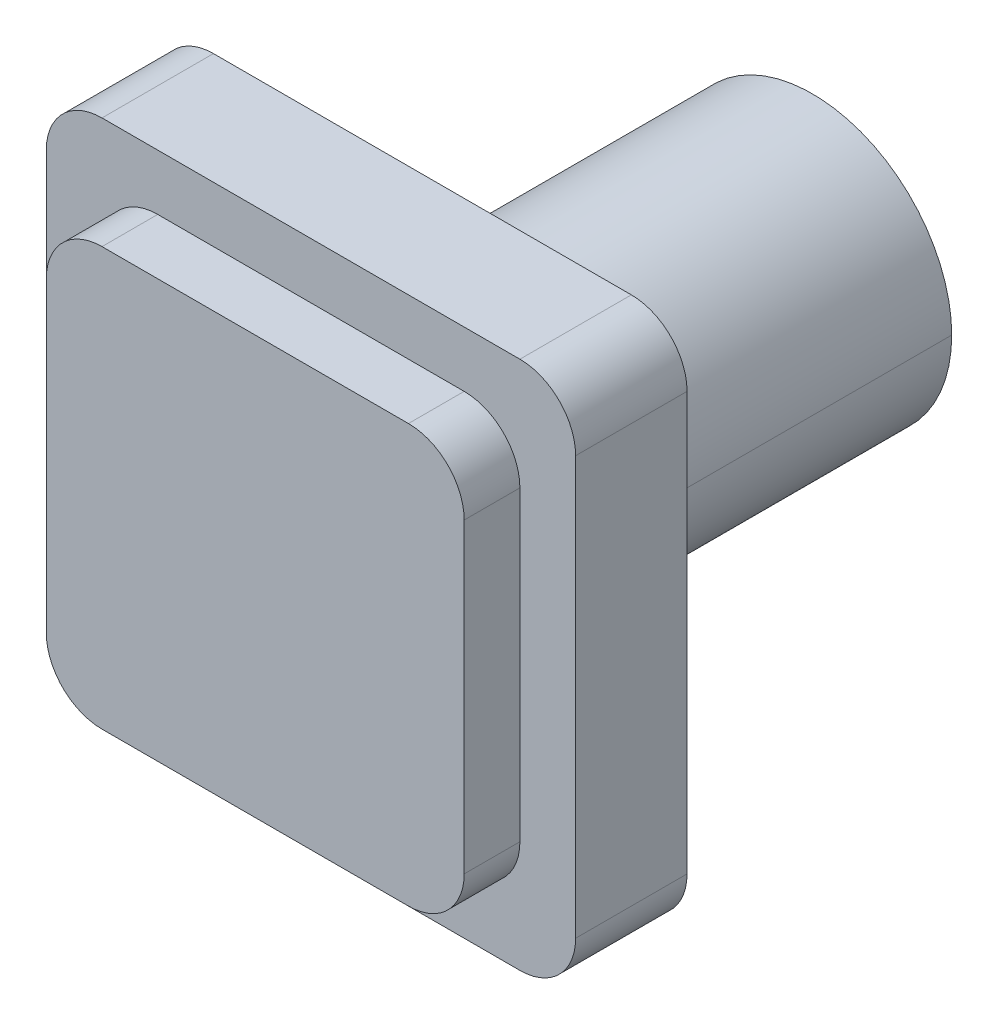
ISO-10303-21;
HEADER;
FILE_DESCRIPTION(('STEP AP214'),'2;1');
FILE_NAME('part.step','',(''),(''),'','','');
FILE_SCHEMA(('AUTOMOTIVE_DESIGN { 1 0 10303 214 1 1 1 1 }'));
ENDSEC;
DATA;
#1=APPLICATION_CONTEXT('core data for automotive mechanical design processes');
#2=APPLICATION_PROTOCOL_DEFINITION('international standard','automotive_design',2000,#1);
#3=PRODUCT_CONTEXT('',#1,'mechanical');
#4=PRODUCT('Part','Part','',(#3));
#5=PRODUCT_RELATED_PRODUCT_CATEGORY('part','',(#4));
#6=PRODUCT_DEFINITION_FORMATION('','',#4);
#7=PRODUCT_DEFINITION_CONTEXT('part definition',#1,'design');
#8=PRODUCT_DEFINITION('design','',#6,#7);
#9=PRODUCT_DEFINITION_SHAPE('','',#8);
#10=(LENGTH_UNIT() NAMED_UNIT(*) SI_UNIT(.MILLI.,.METRE.));
#11=(NAMED_UNIT(*) PLANE_ANGLE_UNIT() SI_UNIT($,.RADIAN.));
#12=(NAMED_UNIT(*) SI_UNIT($,.STERADIAN.) SOLID_ANGLE_UNIT());
#13=UNCERTAINTY_MEASURE_WITH_UNIT(LENGTH_MEASURE(1.E-05),#10,'distance_accuracy_value','');
#14=(GEOMETRIC_REPRESENTATION_CONTEXT(3) GLOBAL_UNCERTAINTY_ASSIGNED_CONTEXT((#13)) GLOBAL_UNIT_ASSIGNED_CONTEXT((#10,
#11,#12)) REPRESENTATION_CONTEXT('',''));
#15=CARTESIAN_POINT('',(0.,0.,0.));
#16=DIRECTION('',(0.,0.,1.));
#17=DIRECTION('',(1.,0.,0.));
#18=AXIS2_PLACEMENT_3D('',#15,#16,#17);
#19=CARTESIAN_POINT('',(0.,0.,-7.));
#20=DIRECTION('',(0.,0.,-1.));
#21=DIRECTION('',(-1.,0.,0.));
#22=AXIS2_PLACEMENT_3D('',#19,#20,#21);
#23=CONICAL_SURFACE('',#22,1.475,0.785398163397435);
#24=DIRECTION('',(0.707106781186538,0.,-0.707106781186557));
#25=VECTOR('',#24,1.);
#26=CARTESIAN_POINT('',(1.475,0.,-7.));
#27=LINE('',#26,#25);
#28=CARTESIAN_POINT('',(1.45,0.,-6.975));
#29=VERTEX_POINT('',#28);
#30=CARTESIAN_POINT('',(1.475,0.,-7.));
#31=VERTEX_POINT('',#30);
#32=EDGE_CURVE('E289',#29,#31,#27,.T.);
#33=ORIENTED_EDGE('',*,*,#32,.F.);
#34=CARTESIAN_POINT('',(0.,0.,-6.975));
#35=DIRECTION('',(0.,0.,-1.));
#36=DIRECTION('',(-1.,0.,0.));
#37=AXIS2_PLACEMENT_3D('',#34,#35,#36);
#38=CIRCLE('',#37,1.45);
#39=CARTESIAN_POINT('',(-1.45,0.,-6.975));
#40=VERTEX_POINT('',#39);
#41=EDGE_CURVE('E11',#40,#29,#38,.T.);
#42=ORIENTED_EDGE('',*,*,#41,.F.);
#43=DIRECTION('',(-0.707106781186538,0.,-0.707106781186557));
#44=VECTOR('',#43,1.);
#45=CARTESIAN_POINT('',(-1.475,0.,-7.));
#46=LINE('',#45,#44);
#47=CARTESIAN_POINT('',(-1.475,0.,-7.));
#48=VERTEX_POINT('',#47);
#49=EDGE_CURVE('E276',#40,#48,#46,.T.);
#50=ORIENTED_EDGE('',*,*,#49,.T.);
#51=CARTESIAN_POINT('',(0.,0.,-7.));
#52=DIRECTION('',(0.,0.,-1.));
#53=DIRECTION('',(-1.,0.,0.));
#54=AXIS2_PLACEMENT_3D('',#51,#52,#53);
#55=CIRCLE('',#54,1.475);
#56=EDGE_CURVE('E282',#48,#31,#55,.T.);
#57=ORIENTED_EDGE('',*,*,#56,.T.);
#58=EDGE_LOOP('',(#33,#42,#50,#57));
#59=FACE_BOUND('',#58,.T.);
#60=ADVANCED_FACE('F17',(#59),#23,.F.);
#61=CARTESIAN_POINT('',(0.,0.,-7.));
#62=DIRECTION('',(0.,0.,-1.));
#63=DIRECTION('',(-1.,0.,0.));
#64=AXIS2_PLACEMENT_3D('',#61,#62,#63);
#65=CYLINDRICAL_SURFACE('',#64,1.45);
#66=DIRECTION('',(0.,0.,-1.));
#67=VECTOR('',#66,1.);
#68=CARTESIAN_POINT('',(1.45,0.,-7.));
#69=LINE('',#68,#67);
#70=CARTESIAN_POINT('',(1.45,0.,-2.));
#71=VERTEX_POINT('',#70);
#72=EDGE_CURVE('E304',#71,#29,#69,.T.);
#73=ORIENTED_EDGE('',*,*,#72,.F.);
#74=CARTESIAN_POINT('',(0.,0.,-2.));
#75=DIRECTION('',(0.,0.,-1.));
#76=DIRECTION('',(-1.,0.,0.));
#77=AXIS2_PLACEMENT_3D('',#74,#75,#76);
#78=CIRCLE('',#77,1.45);
#79=CARTESIAN_POINT('',(-1.45,0.,-2.));
#80=VERTEX_POINT('',#79);
#81=EDGE_CURVE('E21',#80,#71,#78,.T.);
#82=ORIENTED_EDGE('',*,*,#81,.F.);
#83=DIRECTION('',(0.,0.,-1.));
#84=VECTOR('',#83,1.);
#85=CARTESIAN_POINT('',(-1.45,0.,-7.));
#86=LINE('',#85,#84);
#87=EDGE_CURVE('E305',#80,#40,#86,.T.);
#88=ORIENTED_EDGE('',*,*,#87,.T.);
#89=ORIENTED_EDGE('',*,*,#41,.T.);
#90=EDGE_LOOP('',(#73,#82,#88,#89));
#91=FACE_BOUND('',#90,.T.);
#92=ADVANCED_FACE('F509',(#91),#65,.F.);
#93=CARTESIAN_POINT('',(0.,0.,-2.));
#94=DIRECTION('',(0.,0.,-1.));
#95=DIRECTION('',(-1.,0.,0.));
#96=AXIS2_PLACEMENT_3D('',#93,#94,#95);
#97=CONICAL_SURFACE('',#96,1.45,1.02974425867665);
#98=DIRECTION('',(0.857167300702112,0.,-0.515038074910055));
#99=VECTOR('',#98,1.);
#100=CARTESIAN_POINT('',(1.45,0.,-2.));
#101=LINE('',#100,#99);
#102=CARTESIAN_POINT('',(0.,0.,-1.12875210241004));
#103=VERTEX_POINT('',#102);
#104=EDGE_CURVE('E310',#103,#71,#101,.T.);
#105=ORIENTED_EDGE('',*,*,#104,.F.);
#106=DIRECTION('',(-0.857167300702112,0.,-0.515038074910055));
#107=VECTOR('',#106,1.);
#108=CARTESIAN_POINT('',(-1.45,0.,-2.));
#109=LINE('',#108,#107);
#110=EDGE_CURVE('E309',#103,#80,#109,.T.);
#111=ORIENTED_EDGE('',*,*,#110,.T.);
#112=ORIENTED_EDGE('',*,*,#81,.T.);
#113=EDGE_LOOP('',(#105,#111,#112));
#114=FACE_BOUND('',#113,.T.);
#115=ADVANCED_FACE('F515',(#114),#97,.F.);
#116=CARTESIAN_POINT('',(0.,0.,-7.));
#117=DIRECTION('',(0.,0.,-1.));
#118=DIRECTION('',(0.,-1.,0.));
#119=AXIS2_PLACEMENT_3D('',#116,#117,#118);
#120=PLANE('',#119);
#121=ORIENTED_EDGE('',*,*,#56,.F.);
#122=CARTESIAN_POINT('',(0.,0.,-7.));
#123=DIRECTION('',(0.,0.,-1.));
#124=DIRECTION('',(-1.,0.,0.));
#125=AXIS2_PLACEMENT_3D('',#122,#123,#124);
#126=CIRCLE('',#125,1.475);
#127=EDGE_CURVE('E281',#31,#48,#126,.T.);
#128=ORIENTED_EDGE('',*,*,#127,.F.);
#129=EDGE_LOOP('',(#121,#128));
#130=FACE_BOUND('',#129,.T.);
#131=CARTESIAN_POINT('',(0.,0.,-7.));
#132=DIRECTION('',(0.,0.,-1.));
#133=DIRECTION('',(-1.,0.,0.));
#134=AXIS2_PLACEMENT_3D('',#131,#132,#133);
#135=CIRCLE('',#134,2.5);
#136=CARTESIAN_POINT('',(2.5,0.,-7.));
#137=VERTEX_POINT('',#136);
#138=CARTESIAN_POINT('',(-2.5,0.,-7.));
#139=VERTEX_POINT('',#138);
#140=EDGE_CURVE('E285',#137,#139,#135,.T.);
#141=ORIENTED_EDGE('',*,*,#140,.T.);
#142=CARTESIAN_POINT('',(0.,0.,-7.));
#143=DIRECTION('',(0.,0.,-1.));
#144=DIRECTION('',(-1.,0.,0.));
#145=AXIS2_PLACEMENT_3D('',#142,#143,#144);
#146=CIRCLE('',#145,2.5);
#147=EDGE_CURVE('E314',#139,#137,#146,.T.);
#148=ORIENTED_EDGE('',*,*,#147,.T.);
#149=EDGE_LOOP('',(#141,#148));
#150=FACE_BOUND('',#149,.T.);
#151=ADVANCED_FACE('F536',(#130,#150),#120,.T.);
#152=CARTESIAN_POINT('',(0.,0.,-7.));
#153=DIRECTION('',(0.,0.,1.));
#154=DIRECTION('',(1.,0.,0.));
#155=AXIS2_PLACEMENT_3D('',#152,#153,#154);
#156=CYLINDRICAL_SURFACE('',#155,2.5);
#157=DIRECTION('',(0.,0.,1.));
#158=VECTOR('',#157,1.);
#159=CARTESIAN_POINT('',(-2.5,0.,-7.));
#160=LINE('',#159,#158);
#161=CARTESIAN_POINT('',(-2.5,0.,0.));
#162=VERTEX_POINT('',#161);
#163=EDGE_CURVE('E356',#139,#162,#160,.T.);
#164=ORIENTED_EDGE('',*,*,#163,.F.);
#165=ORIENTED_EDGE('',*,*,#140,.F.);
#166=DIRECTION('',(0.,0.,1.));
#167=VECTOR('',#166,1.);
#168=CARTESIAN_POINT('',(2.5,0.,-7.));
#169=LINE('',#168,#167);
#170=CARTESIAN_POINT('',(2.5,0.,0.));
#171=VERTEX_POINT('',#170);
#172=EDGE_CURVE('E430',#137,#171,#169,.T.);
#173=ORIENTED_EDGE('',*,*,#172,.T.);
#174=CARTESIAN_POINT('',(0.,0.,0.));
#175=DIRECTION('',(0.,0.,-1.));
#176=DIRECTION('',(-1.,0.,0.));
#177=AXIS2_PLACEMENT_3D('',#174,#175,#176);
#178=CIRCLE('',#177,2.5);
#179=EDGE_CURVE('E293',#171,#162,#178,.T.);
#180=ORIENTED_EDGE('',*,*,#179,.T.);
#181=EDGE_LOOP('',(#164,#165,#173,#180));
#182=FACE_BOUND('',#181,.T.);
#183=ADVANCED_FACE('F537',(#182),#156,.T.);
#184=CARTESIAN_POINT('',(-2.75,-2.75,3.));
#185=DIRECTION('',(0.,0.,-1.));
#186=DIRECTION('',(0.,-1.,0.));
#187=AXIS2_PLACEMENT_3D('',#184,#185,#186);
#188=PLANE('',#187);
#189=CARTESIAN_POINT('',(-2.75,-2.75,3.));
#190=DIRECTION('',(0.,0.,1.));
#191=DIRECTION('',(-1.,0.,0.));
#192=AXIS2_PLACEMENT_3D('',#189,#190,#191);
#193=CIRCLE('',#192,1.);
#194=CARTESIAN_POINT('',(-3.75,-2.75,3.));
#195=VERTEX_POINT('',#194);
#196=CARTESIAN_POINT('',(-2.75,-3.75,3.));
#197=VERTEX_POINT('',#196);
#198=EDGE_CURVE('E273',#195,#197,#193,.T.);
#199=ORIENTED_EDGE('',*,*,#198,.T.);
#200=DIRECTION('',(1.,0.,0.));
#201=VECTOR('',#200,1.);
#202=CARTESIAN_POINT('',(-2.75,-3.75,3.));
#203=LINE('',#202,#201);
#204=CARTESIAN_POINT('',(2.75,-3.75,3.));
#205=VERTEX_POINT('',#204);
#206=EDGE_CURVE('E365',#197,#205,#203,.T.);
#207=ORIENTED_EDGE('',*,*,#206,.T.);
#208=CARTESIAN_POINT('',(2.75,-2.75,3.));
#209=DIRECTION('',(0.,0.,1.));
#210=DIRECTION('',(1.,0.,0.));
#211=AXIS2_PLACEMENT_3D('',#208,#209,#210);
#212=CIRCLE('',#211,1.);
#213=CARTESIAN_POINT('',(3.75,-2.75,3.));
#214=VERTEX_POINT('',#213);
#215=EDGE_CURVE('E198',#205,#214,#212,.T.);
#216=ORIENTED_EDGE('',*,*,#215,.T.);
#217=DIRECTION('',(0.,1.,0.));
#218=VECTOR('',#217,1.);
#219=CARTESIAN_POINT('',(3.75,-2.75,3.));
#220=LINE('',#219,#218);
#221=CARTESIAN_POINT('',(3.75,2.75,3.));
#222=VERTEX_POINT('',#221);
#223=EDGE_CURVE('E211',#214,#222,#220,.T.);
#224=ORIENTED_EDGE('',*,*,#223,.T.);
#225=CARTESIAN_POINT('',(2.75,2.75,3.));
#226=DIRECTION('',(0.,0.,1.));
#227=DIRECTION('',(-1.,0.,0.));
#228=AXIS2_PLACEMENT_3D('',#225,#226,#227);
#229=CIRCLE('',#228,1.);
#230=CARTESIAN_POINT('',(2.75,3.75,3.));
#231=VERTEX_POINT('',#230);
#232=EDGE_CURVE('E364',#222,#231,#229,.T.);
#233=ORIENTED_EDGE('',*,*,#232,.T.);
#234=DIRECTION('',(-1.,0.,0.));
#235=VECTOR('',#234,1.);
#236=CARTESIAN_POINT('',(-2.75,3.75,3.));
#237=LINE('',#236,#235);
#238=CARTESIAN_POINT('',(-2.75,3.75,3.));
#239=VERTEX_POINT('',#238);
#240=EDGE_CURVE('E420',#231,#239,#237,.T.);
#241=ORIENTED_EDGE('',*,*,#240,.T.);
#242=CARTESIAN_POINT('',(-2.75,2.75,3.));
#243=DIRECTION('',(0.,0.,1.));
#244=DIRECTION('',(-1.,0.,0.));
#245=AXIS2_PLACEMENT_3D('',#242,#243,#244);
#246=CIRCLE('',#245,1.);
#247=CARTESIAN_POINT('',(-3.75,2.75,3.));
#248=VERTEX_POINT('',#247);
#249=EDGE_CURVE('E325',#239,#248,#246,.T.);
#250=ORIENTED_EDGE('',*,*,#249,.T.);
#251=DIRECTION('',(0.,-1.,0.));
#252=VECTOR('',#251,1.);
#253=CARTESIAN_POINT('',(-3.75,-2.75,3.));
#254=LINE('',#253,#252);
#255=EDGE_CURVE('E42',#248,#195,#254,.T.);
#256=ORIENTED_EDGE('',*,*,#255,.T.);
#257=EDGE_LOOP('',(#199,#207,#216,#224,#233,#241,#250,#256));
#258=FACE_BOUND('',#257,.T.);
#259=ADVANCED_FACE('F539',(#258),#188,.F.);
#260=CARTESIAN_POINT('',(-3.75,-2.75,3.));
#261=DIRECTION('',(1.,0.,0.));
#262=DIRECTION('',(0.,1.,0.));
#263=AXIS2_PLACEMENT_3D('',#260,#261,#262);
#264=PLANE('',#263);
#265=DIRECTION('',(0.,-1.,0.));
#266=VECTOR('',#265,1.);
#267=CARTESIAN_POINT('',(-3.75,-2.75,2.));
#268=LINE('',#267,#266);
#269=CARTESIAN_POINT('',(-3.75,2.75,2.));
#270=VERTEX_POINT('',#269);
#271=CARTESIAN_POINT('',(-3.75,-2.75,2.));
#272=VERTEX_POINT('',#271);
#273=EDGE_CURVE('E319',#270,#272,#268,.T.);
#274=ORIENTED_EDGE('',*,*,#273,.T.);
#275=DIRECTION('',(0.,0.,-1.));
#276=VECTOR('',#275,1.);
#277=CARTESIAN_POINT('',(-3.75,-2.75,3.));
#278=LINE('',#277,#276);
#279=EDGE_CURVE('E269',#195,#272,#278,.T.);
#280=ORIENTED_EDGE('',*,*,#279,.F.);
#281=ORIENTED_EDGE('',*,*,#255,.F.);
#282=DIRECTION('',(0.,0.,-1.));
#283=VECTOR('',#282,1.);
#284=CARTESIAN_POINT('',(-3.75,2.75,3.));
#285=LINE('',#284,#283);
#286=EDGE_CURVE('E328',#248,#270,#285,.T.);
#287=ORIENTED_EDGE('',*,*,#286,.T.);
#288=EDGE_LOOP('',(#274,#280,#281,#287));
#289=FACE_BOUND('',#288,.T.);
#290=ADVANCED_FACE('F545',(#289),#264,.F.);
#291=CARTESIAN_POINT('',(-2.75,2.75,3.));
#292=DIRECTION('',(0.,0.,-1.));
#293=DIRECTION('',(-1.,0.,0.));
#294=AXIS2_PLACEMENT_3D('',#291,#292,#293);
#295=CYLINDRICAL_SURFACE('',#294,1.);
#296=CARTESIAN_POINT('',(-2.75,2.75,2.));
#297=DIRECTION('',(0.,0.,1.));
#298=DIRECTION('',(-1.,0.,0.));
#299=AXIS2_PLACEMENT_3D('',#296,#297,#298);
#300=CIRCLE('',#299,1.);
#301=CARTESIAN_POINT('',(-2.75,3.75,2.));
#302=VERTEX_POINT('',#301);
#303=EDGE_CURVE('E332',#302,#270,#300,.T.);
#304=ORIENTED_EDGE('',*,*,#303,.T.);
#305=ORIENTED_EDGE('',*,*,#286,.F.);
#306=ORIENTED_EDGE('',*,*,#249,.F.);
#307=DIRECTION('',(0.,0.,-1.));
#308=VECTOR('',#307,1.);
#309=CARTESIAN_POINT('',(-2.75,3.75,3.));
#310=LINE('',#309,#308);
#311=EDGE_CURVE('E431',#239,#302,#310,.T.);
#312=ORIENTED_EDGE('',*,*,#311,.T.);
#313=EDGE_LOOP('',(#304,#305,#306,#312));
#314=FACE_BOUND('',#313,.T.);
#315=ADVANCED_FACE('F674',(#314),#295,.T.);
#316=CARTESIAN_POINT('',(-2.75,3.75,3.));
#317=DIRECTION('',(0.,-1.,0.));
#318=DIRECTION('',(0.,0.,-1.));
#319=AXIS2_PLACEMENT_3D('',#316,#317,#318);
#320=PLANE('',#319);
#321=DIRECTION('',(-1.,0.,0.));
#322=VECTOR('',#321,1.);
#323=CARTESIAN_POINT('',(-2.75,3.75,2.));
#324=LINE('',#323,#322);
#325=CARTESIAN_POINT('',(2.75,3.75,2.));
#326=VERTEX_POINT('',#325);
#327=EDGE_CURVE('E336',#326,#302,#324,.T.);
#328=ORIENTED_EDGE('',*,*,#327,.T.);
#329=ORIENTED_EDGE('',*,*,#311,.F.);
#330=ORIENTED_EDGE('',*,*,#240,.F.);
#331=DIRECTION('',(0.,0.,-1.));
#332=VECTOR('',#331,1.);
#333=CARTESIAN_POINT('',(2.75,3.75,3.));
#334=LINE('',#333,#332);
#335=EDGE_CURVE('E361',#231,#326,#334,.T.);
#336=ORIENTED_EDGE('',*,*,#335,.T.);
#337=EDGE_LOOP('',(#328,#329,#330,#336));
#338=FACE_BOUND('',#337,.T.);
#339=ADVANCED_FACE('F565',(#338),#320,.F.);
#340=CARTESIAN_POINT('',(2.75,2.75,3.));
#341=DIRECTION('',(0.,0.,-1.));
#342=DIRECTION('',(-1.,0.,0.));
#343=AXIS2_PLACEMENT_3D('',#340,#341,#342);
#344=CYLINDRICAL_SURFACE('',#343,1.);
#345=CARTESIAN_POINT('',(2.75,2.75,2.));
#346=DIRECTION('',(0.,0.,1.));
#347=DIRECTION('',(-1.,0.,0.));
#348=AXIS2_PLACEMENT_3D('',#345,#346,#347);
#349=CIRCLE('',#348,1.);
#350=CARTESIAN_POINT('',(3.75,2.75,2.));
#351=VERTEX_POINT('',#350);
#352=EDGE_CURVE('E339',#351,#326,#349,.T.);
#353=ORIENTED_EDGE('',*,*,#352,.T.);
#354=ORIENTED_EDGE('',*,*,#335,.F.);
#355=ORIENTED_EDGE('',*,*,#232,.F.);
#356=DIRECTION('',(0.,0.,-1.));
#357=VECTOR('',#356,1.);
#358=CARTESIAN_POINT('',(3.75,2.75,3.));
#359=LINE('',#358,#357);
#360=EDGE_CURVE('E399',#222,#351,#359,.T.);
#361=ORIENTED_EDGE('',*,*,#360,.T.);
#362=EDGE_LOOP('',(#353,#354,#355,#361));
#363=FACE_BOUND('',#362,.T.);
#364=ADVANCED_FACE('F574',(#363),#344,.T.);
#365=CARTESIAN_POINT('',(3.75,-2.75,3.));
#366=DIRECTION('',(-1.,0.,0.));
#367=DIRECTION('',(0.,0.,1.));
#368=AXIS2_PLACEMENT_3D('',#365,#366,#367);
#369=PLANE('',#368);
#370=DIRECTION('',(0.,1.,0.));
#371=VECTOR('',#370,1.);
#372=CARTESIAN_POINT('',(3.75,-2.75,2.));
#373=LINE('',#372,#371);
#374=CARTESIAN_POINT('',(3.75,-2.75,2.));
#375=VERTEX_POINT('',#374);
#376=EDGE_CURVE('E352',#375,#351,#373,.T.);
#377=ORIENTED_EDGE('',*,*,#376,.T.);
#378=ORIENTED_EDGE('',*,*,#360,.F.);
#379=ORIENTED_EDGE('',*,*,#223,.F.);
#380=DIRECTION('',(0.,0.,-1.));
#381=VECTOR('',#380,1.);
#382=CARTESIAN_POINT('',(3.75,-2.75,3.));
#383=LINE('',#382,#381);
#384=EDGE_CURVE('E368',#214,#375,#383,.T.);
#385=ORIENTED_EDGE('',*,*,#384,.T.);
#386=EDGE_LOOP('',(#377,#378,#379,#385));
#387=FACE_BOUND('',#386,.T.);
#388=ADVANCED_FACE('F571',(#387),#369,.F.);
#389=CARTESIAN_POINT('',(2.75,-2.75,3.));
#390=DIRECTION('',(0.,0.,-1.));
#391=DIRECTION('',(-1.,0.,0.));
#392=AXIS2_PLACEMENT_3D('',#389,#390,#391);
#393=CYLINDRICAL_SURFACE('',#392,1.);
#394=CARTESIAN_POINT('',(2.75,-2.75,2.));
#395=DIRECTION('',(0.,0.,1.));
#396=DIRECTION('',(1.,0.,0.));
#397=AXIS2_PLACEMENT_3D('',#394,#395,#396);
#398=CIRCLE('',#397,1.);
#399=CARTESIAN_POINT('',(2.75,-3.75,2.));
#400=VERTEX_POINT('',#399);
#401=EDGE_CURVE('E260',#400,#375,#398,.T.);
#402=ORIENTED_EDGE('',*,*,#401,.T.);
#403=ORIENTED_EDGE('',*,*,#384,.F.);
#404=ORIENTED_EDGE('',*,*,#215,.F.);
#405=DIRECTION('',(0.,0.,-1.));
#406=VECTOR('',#405,1.);
#407=CARTESIAN_POINT('',(2.75,-3.75,3.));
#408=LINE('',#407,#406);
#409=EDGE_CURVE('E272',#205,#400,#408,.T.);
#410=ORIENTED_EDGE('',*,*,#409,.T.);
#411=EDGE_LOOP('',(#402,#403,#404,#410));
#412=FACE_BOUND('',#411,.T.);
#413=ADVANCED_FACE('F570',(#412),#393,.T.);
#414=CARTESIAN_POINT('',(-2.75,-3.75,3.));
#415=DIRECTION('',(0.,1.,0.));
#416=DIRECTION('',(1.,0.,0.));
#417=AXIS2_PLACEMENT_3D('',#414,#415,#416);
#418=PLANE('',#417);
#419=DIRECTION('',(1.,0.,0.));
#420=VECTOR('',#419,1.);
#421=CARTESIAN_POINT('',(-2.75,-3.75,2.));
#422=LINE('',#421,#420);
#423=CARTESIAN_POINT('',(-2.75,-3.75,2.));
#424=VERTEX_POINT('',#423);
#425=EDGE_CURVE('E252',#424,#400,#422,.T.);
#426=ORIENTED_EDGE('',*,*,#425,.T.);
#427=ORIENTED_EDGE('',*,*,#409,.F.);
#428=ORIENTED_EDGE('',*,*,#206,.F.);
#429=DIRECTION('',(0.,0.,-1.));
#430=VECTOR('',#429,1.);
#431=CARTESIAN_POINT('',(-2.75,-3.75,3.));
#432=LINE('',#431,#430);
#433=EDGE_CURVE('E372',#197,#424,#432,.T.);
#434=ORIENTED_EDGE('',*,*,#433,.T.);
#435=EDGE_LOOP('',(#426,#427,#428,#434));
#436=FACE_BOUND('',#435,.T.);
#437=ADVANCED_FACE('F567',(#436),#418,.F.);
#438=CARTESIAN_POINT('',(-2.75,-2.75,3.));
#439=DIRECTION('',(0.,0.,-1.));
#440=DIRECTION('',(-1.,0.,0.));
#441=AXIS2_PLACEMENT_3D('',#438,#439,#440);
#442=CYLINDRICAL_SURFACE('',#441,1.);
#443=CARTESIAN_POINT('',(-2.75,-2.75,2.));
#444=DIRECTION('',(0.,0.,1.));
#445=DIRECTION('',(-1.,0.,0.));
#446=AXIS2_PLACEMENT_3D('',#443,#444,#445);
#447=CIRCLE('',#446,1.);
#448=EDGE_CURVE('E315',#272,#424,#447,.T.);
#449=ORIENTED_EDGE('',*,*,#448,.T.);
#450=ORIENTED_EDGE('',*,*,#433,.F.);
#451=ORIENTED_EDGE('',*,*,#198,.F.);
#452=ORIENTED_EDGE('',*,*,#279,.T.);
#453=EDGE_LOOP('',(#449,#450,#451,#452));
#454=FACE_BOUND('',#453,.T.);
#455=ADVANCED_FACE('F551',(#454),#442,.T.);
#456=CARTESIAN_POINT('',(-3.75,3.75,0.));
#457=DIRECTION('',(0.,0.,-1.));
#458=DIRECTION('',(0.,-1.,0.));
#459=AXIS2_PLACEMENT_3D('',#456,#457,#458);
#460=PLANE('',#459);
#461=ORIENTED_EDGE('',*,*,#179,.F.);
#462=CARTESIAN_POINT('',(0.,0.,0.));
#463=DIRECTION('',(0.,0.,-1.));
#464=DIRECTION('',(-1.,0.,0.));
#465=AXIS2_PLACEMENT_3D('',#462,#463,#464);
#466=CIRCLE('',#465,2.5);
#467=EDGE_CURVE('E359',#162,#171,#466,.T.);
#468=ORIENTED_EDGE('',*,*,#467,.F.);
#469=EDGE_LOOP('',(#461,#468));
#470=FACE_BOUND('',#469,.T.);
#471=DIRECTION('',(0.,1.,0.));
#472=VECTOR('',#471,1.);
#473=CARTESIAN_POINT('',(-4.75,-3.75,0.));
#474=LINE('',#473,#472);
#475=CARTESIAN_POINT('',(-4.75,-3.75,0.));
#476=VERTEX_POINT('',#475);
#477=CARTESIAN_POINT('',(-4.75,3.75,0.));
#478=VERTEX_POINT('',#477);
#479=EDGE_CURVE('E231',#476,#478,#474,.T.);
#480=ORIENTED_EDGE('',*,*,#479,.T.);
#481=CARTESIAN_POINT('',(-3.75,3.75,0.));
#482=DIRECTION('',(0.,0.,-1.));
#483=DIRECTION('',(-1.,0.,0.));
#484=AXIS2_PLACEMENT_3D('',#481,#482,#483);
#485=CIRCLE('',#484,1.);
#486=CARTESIAN_POINT('',(-3.75,4.75,0.));
#487=VERTEX_POINT('',#486);
#488=EDGE_CURVE('E290',#478,#487,#485,.T.);
#489=ORIENTED_EDGE('',*,*,#488,.T.);
#490=DIRECTION('',(1.,0.,0.));
#491=VECTOR('',#490,1.);
#492=CARTESIAN_POINT('',(-3.75,4.75,0.));
#493=LINE('',#492,#491);
#494=CARTESIAN_POINT('',(3.75,4.75,0.));
#495=VERTEX_POINT('',#494);
#496=EDGE_CURVE('E348',#487,#495,#493,.T.);
#497=ORIENTED_EDGE('',*,*,#496,.T.);
#498=CARTESIAN_POINT('',(3.75,3.75,0.));
#499=DIRECTION('',(0.,0.,1.));
#500=DIRECTION('',(1.,0.,0.));
#501=AXIS2_PLACEMENT_3D('',#498,#499,#500);
#502=CIRCLE('',#501,1.);
#503=CARTESIAN_POINT('',(4.75,3.75,0.));
#504=VERTEX_POINT('',#503);
#505=EDGE_CURVE('E268',#504,#495,#502,.T.);
#506=ORIENTED_EDGE('',*,*,#505,.F.);
#507=DIRECTION('',(0.,1.,0.));
#508=VECTOR('',#507,1.);
#509=CARTESIAN_POINT('',(4.75,-3.75,0.));
#510=LINE('',#509,#508);
#511=CARTESIAN_POINT('',(4.75,-3.75,0.));
#512=VERTEX_POINT('',#511);
#513=EDGE_CURVE('E131',#512,#504,#510,.T.);
#514=ORIENTED_EDGE('',*,*,#513,.F.);
#515=CARTESIAN_POINT('',(3.75,-3.75,0.));
#516=DIRECTION('',(0.,0.,1.));
#517=DIRECTION('',(1.,0.,0.));
#518=AXIS2_PLACEMENT_3D('',#515,#516,#517);
#519=CIRCLE('',#518,1.);
#520=CARTESIAN_POINT('',(3.75,-4.75,0.));
#521=VERTEX_POINT('',#520);
#522=EDGE_CURVE('E140',#521,#512,#519,.T.);
#523=ORIENTED_EDGE('',*,*,#522,.F.);
#524=DIRECTION('',(1.,0.,0.));
#525=VECTOR('',#524,1.);
#526=CARTESIAN_POINT('',(-3.75,-4.75,0.));
#527=LINE('',#526,#525);
#528=CARTESIAN_POINT('',(-3.75,-4.75,0.));
#529=VERTEX_POINT('',#528);
#530=EDGE_CURVE('E233',#529,#521,#527,.T.);
#531=ORIENTED_EDGE('',*,*,#530,.F.);
#532=CARTESIAN_POINT('',(-3.75,-3.75,0.));
#533=DIRECTION('',(0.,0.,-1.));
#534=DIRECTION('',(-1.,0.,0.));
#535=AXIS2_PLACEMENT_3D('',#532,#533,#534);
#536=CIRCLE('',#535,1.);
#537=EDGE_CURVE('E227',#529,#476,#536,.T.);
#538=ORIENTED_EDGE('',*,*,#537,.T.);
#539=EDGE_LOOP('',(#480,#489,#497,#506,#514,#523,#531,#538));
#540=FACE_BOUND('',#539,.T.);
#541=ADVANCED_FACE('F229',(#470,#540),#460,.T.);
#542=CARTESIAN_POINT('',(-3.75,3.75,2.));
#543=DIRECTION('',(0.,0.,-1.));
#544=DIRECTION('',(-1.,0.,0.));
#545=AXIS2_PLACEMENT_3D('',#542,#543,#544);
#546=CYLINDRICAL_SURFACE('',#545,1.);
#547=ORIENTED_EDGE('',*,*,#488,.F.);
#548=DIRECTION('',(0.,0.,-1.));
#549=VECTOR('',#548,1.);
#550=CARTESIAN_POINT('',(-4.75,3.75,2.));
#551=LINE('',#550,#549);
#552=CARTESIAN_POINT('',(-4.75,3.75,2.));
#553=VERTEX_POINT('',#552);
#554=EDGE_CURVE('E238',#553,#478,#551,.T.);
#555=ORIENTED_EDGE('',*,*,#554,.F.);
#556=CARTESIAN_POINT('',(-3.75,3.75,2.));
#557=DIRECTION('',(0.,0.,-1.));
#558=DIRECTION('',(-1.,0.,0.));
#559=AXIS2_PLACEMENT_3D('',#556,#557,#558);
#560=CIRCLE('',#559,1.);
#561=CARTESIAN_POINT('',(-3.75,4.75,2.));
#562=VERTEX_POINT('',#561);
#563=EDGE_CURVE('E320',#553,#562,#560,.T.);
#564=ORIENTED_EDGE('',*,*,#563,.T.);
#565=DIRECTION('',(0.,0.,-1.));
#566=VECTOR('',#565,1.);
#567=CARTESIAN_POINT('',(-3.75,4.75,2.));
#568=LINE('',#567,#566);
#569=EDGE_CURVE('E294',#562,#487,#568,.T.);
#570=ORIENTED_EDGE('',*,*,#569,.T.);
#571=EDGE_LOOP('',(#547,#555,#564,#570));
#572=FACE_BOUND('',#571,.T.);
#573=ADVANCED_FACE('F489',(#572),#546,.T.);
#574=CARTESIAN_POINT('',(-3.75,4.75,2.));
#575=DIRECTION('',(0.,1.,0.));
#576=DIRECTION('',(1.,0.,0.));
#577=AXIS2_PLACEMENT_3D('',#574,#575,#576);
#578=PLANE('',#577);
#579=ORIENTED_EDGE('',*,*,#496,.F.);
#580=ORIENTED_EDGE('',*,*,#569,.F.);
#581=DIRECTION('',(1.,0.,0.));
#582=VECTOR('',#581,1.);
#583=CARTESIAN_POINT('',(-3.75,4.75,2.));
#584=LINE('',#583,#582);
#585=CARTESIAN_POINT('',(3.75,4.75,2.));
#586=VERTEX_POINT('',#585);
#587=EDGE_CURVE('E408',#562,#586,#584,.T.);
#588=ORIENTED_EDGE('',*,*,#587,.T.);
#589=DIRECTION('',(0.,0.,-1.));
#590=VECTOR('',#589,1.);
#591=CARTESIAN_POINT('',(3.75,4.75,2.));
#592=LINE('',#591,#590);
#593=EDGE_CURVE('E343',#586,#495,#592,.T.);
#594=ORIENTED_EDGE('',*,*,#593,.T.);
#595=EDGE_LOOP('',(#579,#580,#588,#594));
#596=FACE_BOUND('',#595,.T.);
#597=ADVANCED_FACE('F480',(#596),#578,.T.);
#598=CARTESIAN_POINT('',(3.75,3.75,2.));
#599=DIRECTION('',(0.,0.,-1.));
#600=DIRECTION('',(-1.,0.,0.));
#601=AXIS2_PLACEMENT_3D('',#598,#599,#600);
#602=CYLINDRICAL_SURFACE('',#601,1.);
#603=ORIENTED_EDGE('',*,*,#505,.T.);
#604=ORIENTED_EDGE('',*,*,#593,.F.);
#605=CARTESIAN_POINT('',(3.75,3.75,2.));
#606=DIRECTION('',(0.,0.,1.));
#607=DIRECTION('',(1.,0.,0.));
#608=AXIS2_PLACEMENT_3D('',#605,#606,#607);
#609=CIRCLE('',#608,1.);
#610=CARTESIAN_POINT('',(4.75,3.75,2.));
#611=VERTEX_POINT('',#610);
#612=EDGE_CURVE('E404',#611,#586,#609,.T.);
#613=ORIENTED_EDGE('',*,*,#612,.F.);
#614=DIRECTION('',(0.,0.,-1.));
#615=VECTOR('',#614,1.);
#616=CARTESIAN_POINT('',(4.75,3.75,2.));
#617=LINE('',#616,#615);
#618=EDGE_CURVE('E265',#611,#504,#617,.T.);
#619=ORIENTED_EDGE('',*,*,#618,.T.);
#620=EDGE_LOOP('',(#603,#604,#613,#619));
#621=FACE_BOUND('',#620,.T.);
#622=ADVANCED_FACE('F487',(#621),#602,.T.);
#623=CARTESIAN_POINT('',(4.75,-3.75,2.));
#624=DIRECTION('',(-1.,0.,0.));
#625=DIRECTION('',(0.,0.,1.));
#626=AXIS2_PLACEMENT_3D('',#623,#624,#625);
#627=PLANE('',#626);
#628=ORIENTED_EDGE('',*,*,#513,.T.);
#629=ORIENTED_EDGE('',*,*,#618,.F.);
#630=DIRECTION('',(0.,1.,0.));
#631=VECTOR('',#630,1.);
#632=CARTESIAN_POINT('',(4.75,-3.75,2.));
#633=LINE('',#632,#631);
#634=CARTESIAN_POINT('',(4.75,-3.75,2.));
#635=VERTEX_POINT('',#634);
#636=EDGE_CURVE('E299',#635,#611,#633,.T.);
#637=ORIENTED_EDGE('',*,*,#636,.F.);
#638=DIRECTION('',(0.,0.,-1.));
#639=VECTOR('',#638,1.);
#640=CARTESIAN_POINT('',(4.75,-3.75,2.));
#641=LINE('',#640,#639);
#642=EDGE_CURVE('E369',#635,#512,#641,.T.);
#643=ORIENTED_EDGE('',*,*,#642,.T.);
#644=EDGE_LOOP('',(#628,#629,#637,#643));
#645=FACE_BOUND('',#644,.T.);
#646=ADVANCED_FACE('F497',(#645),#627,.F.);
#647=CARTESIAN_POINT('',(3.75,-3.75,2.));
#648=DIRECTION('',(0.,0.,-1.));
#649=DIRECTION('',(-1.,0.,0.));
#650=AXIS2_PLACEMENT_3D('',#647,#648,#649);
#651=CYLINDRICAL_SURFACE('',#650,1.);
#652=ORIENTED_EDGE('',*,*,#522,.T.);
#653=ORIENTED_EDGE('',*,*,#642,.F.);
#654=CARTESIAN_POINT('',(3.75,-3.75,2.));
#655=DIRECTION('',(0.,0.,1.));
#656=DIRECTION('',(1.,0.,0.));
#657=AXIS2_PLACEMENT_3D('',#654,#655,#656);
#658=CIRCLE('',#657,1.);
#659=CARTESIAN_POINT('',(3.75,-4.75,2.));
#660=VERTEX_POINT('',#659);
#661=EDGE_CURVE('E295',#660,#635,#658,.T.);
#662=ORIENTED_EDGE('',*,*,#661,.F.);
#663=DIRECTION('',(0.,0.,-1.));
#664=VECTOR('',#663,1.);
#665=CARTESIAN_POINT('',(3.75,-4.75,2.));
#666=LINE('',#665,#664);
#667=EDGE_CURVE('E395',#660,#521,#666,.T.);
#668=ORIENTED_EDGE('',*,*,#667,.T.);
#669=EDGE_LOOP('',(#652,#653,#662,#668));
#670=FACE_BOUND('',#669,.T.);
#671=ADVANCED_FACE('F495',(#670),#651,.T.);
#672=CARTESIAN_POINT('',(-3.75,-4.75,2.));
#673=DIRECTION('',(0.,1.,0.));
#674=DIRECTION('',(1.,0.,0.));
#675=AXIS2_PLACEMENT_3D('',#672,#673,#674);
#676=PLANE('',#675);
#677=ORIENTED_EDGE('',*,*,#530,.T.);
#678=ORIENTED_EDGE('',*,*,#667,.F.);
#679=DIRECTION('',(1.,0.,0.));
#680=VECTOR('',#679,1.);
#681=CARTESIAN_POINT('',(-3.75,-4.75,2.));
#682=LINE('',#681,#680);
#683=CARTESIAN_POINT('',(-3.75,-4.75,2.));
#684=VERTEX_POINT('',#683);
#685=EDGE_CURVE('E300',#684,#660,#682,.T.);
#686=ORIENTED_EDGE('',*,*,#685,.F.);
#687=DIRECTION('',(0.,0.,-1.));
#688=VECTOR('',#687,1.);
#689=CARTESIAN_POINT('',(-3.75,-4.75,2.));
#690=LINE('',#689,#688);
#691=EDGE_CURVE('E237',#684,#529,#690,.T.);
#692=ORIENTED_EDGE('',*,*,#691,.T.);
#693=EDGE_LOOP('',(#677,#678,#686,#692));
#694=FACE_BOUND('',#693,.T.);
#695=ADVANCED_FACE('F493',(#694),#676,.F.);
#696=CARTESIAN_POINT('',(-3.75,-3.75,2.));
#697=DIRECTION('',(0.,0.,-1.));
#698=DIRECTION('',(-1.,0.,0.));
#699=AXIS2_PLACEMENT_3D('',#696,#697,#698);
#700=CYLINDRICAL_SURFACE('',#699,1.);
#701=ORIENTED_EDGE('',*,*,#537,.F.);
#702=ORIENTED_EDGE('',*,*,#691,.F.);
#703=CARTESIAN_POINT('',(-3.75,-3.75,2.));
#704=DIRECTION('',(0.,0.,-1.));
#705=DIRECTION('',(-1.,0.,0.));
#706=AXIS2_PLACEMENT_3D('',#703,#704,#705);
#707=CIRCLE('',#706,1.);
#708=CARTESIAN_POINT('',(-4.75,-3.75,2.));
#709=VERTEX_POINT('',#708);
#710=EDGE_CURVE('E244',#684,#709,#707,.T.);
#711=ORIENTED_EDGE('',*,*,#710,.T.);
#712=DIRECTION('',(0.,0.,-1.));
#713=VECTOR('',#712,1.);
#714=CARTESIAN_POINT('',(-4.75,-3.75,2.));
#715=LINE('',#714,#713);
#716=EDGE_CURVE('E241',#709,#476,#715,.T.);
#717=ORIENTED_EDGE('',*,*,#716,.T.);
#718=EDGE_LOOP('',(#701,#702,#711,#717));
#719=FACE_BOUND('',#718,.T.);
#720=ADVANCED_FACE('F242',(#719),#700,.T.);
#721=CARTESIAN_POINT('',(-4.75,-3.75,2.));
#722=DIRECTION('',(-1.,0.,0.));
#723=DIRECTION('',(0.,0.,1.));
#724=AXIS2_PLACEMENT_3D('',#721,#722,#723);
#725=PLANE('',#724);
#726=ORIENTED_EDGE('',*,*,#479,.F.);
#727=ORIENTED_EDGE('',*,*,#716,.F.);
#728=DIRECTION('',(0.,1.,0.));
#729=VECTOR('',#728,1.);
#730=CARTESIAN_POINT('',(-4.75,-3.75,2.));
#731=LINE('',#730,#729);
#732=EDGE_CURVE('E446',#709,#553,#731,.T.);
#733=ORIENTED_EDGE('',*,*,#732,.T.);
#734=ORIENTED_EDGE('',*,*,#554,.T.);
#735=EDGE_LOOP('',(#726,#727,#733,#734));
#736=FACE_BOUND('',#735,.T.);
#737=ADVANCED_FACE('F19',(#736),#725,.T.);
#738=CARTESIAN_POINT('',(-3.75,3.75,2.));
#739=DIRECTION('',(0.,0.,-1.));
#740=DIRECTION('',(0.,-1.,0.));
#741=AXIS2_PLACEMENT_3D('',#738,#739,#740);
#742=PLANE('',#741);
#743=ORIENTED_EDGE('',*,*,#448,.F.);
#744=ORIENTED_EDGE('',*,*,#273,.F.);
#745=ORIENTED_EDGE('',*,*,#303,.F.);
#746=ORIENTED_EDGE('',*,*,#327,.F.);
#747=ORIENTED_EDGE('',*,*,#352,.F.);
#748=ORIENTED_EDGE('',*,*,#376,.F.);
#749=ORIENTED_EDGE('',*,*,#401,.F.);
#750=ORIENTED_EDGE('',*,*,#425,.F.);
#751=EDGE_LOOP('',(#743,#744,#745,#746,#747,#748,#749,#750));
#752=FACE_BOUND('',#751,.T.);
#753=ORIENTED_EDGE('',*,*,#732,.F.);
#754=ORIENTED_EDGE('',*,*,#710,.F.);
#755=ORIENTED_EDGE('',*,*,#685,.T.);
#756=ORIENTED_EDGE('',*,*,#661,.T.);
#757=ORIENTED_EDGE('',*,*,#636,.T.);
#758=ORIENTED_EDGE('',*,*,#612,.T.);
#759=ORIENTED_EDGE('',*,*,#587,.F.);
#760=ORIENTED_EDGE('',*,*,#563,.F.);
#761=EDGE_LOOP('',(#753,#754,#755,#756,#757,#758,#759,#760));
#762=FACE_BOUND('',#761,.T.);
#763=ADVANCED_FACE('F484',(#752,#762),#742,.F.);
#764=CARTESIAN_POINT('',(0.,0.,-7.));
#765=DIRECTION('',(0.,0.,1.));
#766=DIRECTION('',(1.,0.,0.));
#767=AXIS2_PLACEMENT_3D('',#764,#765,#766);
#768=CYLINDRICAL_SURFACE('',#767,2.5);
#769=ORIENTED_EDGE('',*,*,#147,.F.);
#770=ORIENTED_EDGE('',*,*,#163,.T.);
#771=ORIENTED_EDGE('',*,*,#467,.T.);
#772=ORIENTED_EDGE('',*,*,#172,.F.);
#773=EDGE_LOOP('',(#769,#770,#771,#772));
#774=FACE_BOUND('',#773,.T.);
#775=ADVANCED_FACE('F520',(#774),#768,.T.);
#776=CARTESIAN_POINT('',(0.,0.,-2.));
#777=DIRECTION('',(0.,0.,-1.));
#778=DIRECTION('',(-1.,0.,0.));
#779=AXIS2_PLACEMENT_3D('',#776,#777,#778);
#780=CONICAL_SURFACE('',#779,1.45,1.02974425867665);
#781=ORIENTED_EDGE('',*,*,#110,.F.);
#782=ORIENTED_EDGE('',*,*,#104,.T.);
#783=CARTESIAN_POINT('',(0.,0.,-2.));
#784=DIRECTION('',(0.,0.,-1.));
#785=DIRECTION('',(-1.,0.,0.));
#786=AXIS2_PLACEMENT_3D('',#783,#784,#785);
#787=CIRCLE('',#786,1.45);
#788=EDGE_CURVE('E280',#71,#80,#787,.T.);
#789=ORIENTED_EDGE('',*,*,#788,.T.);
#790=EDGE_LOOP('',(#781,#782,#789));
#791=FACE_BOUND('',#790,.T.);
#792=ADVANCED_FACE('F522',(#791),#780,.F.);
#793=CARTESIAN_POINT('',(0.,0.,-7.));
#794=DIRECTION('',(0.,0.,-1.));
#795=DIRECTION('',(-1.,0.,0.));
#796=AXIS2_PLACEMENT_3D('',#793,#794,#795);
#797=CYLINDRICAL_SURFACE('',#796,1.45);
#798=ORIENTED_EDGE('',*,*,#788,.F.);
#799=ORIENTED_EDGE('',*,*,#72,.T.);
#800=CARTESIAN_POINT('',(0.,0.,-6.975));
#801=DIRECTION('',(0.,0.,-1.));
#802=DIRECTION('',(-1.,0.,0.));
#803=AXIS2_PLACEMENT_3D('',#800,#801,#802);
#804=CIRCLE('',#803,1.45);
#805=EDGE_CURVE('E324',#29,#40,#804,.T.);
#806=ORIENTED_EDGE('',*,*,#805,.T.);
#807=ORIENTED_EDGE('',*,*,#87,.F.);
#808=EDGE_LOOP('',(#798,#799,#806,#807));
#809=FACE_BOUND('',#808,.T.);
#810=ADVANCED_FACE('F528',(#809),#797,.F.);
#811=CARTESIAN_POINT('',(0.,0.,-7.));
#812=DIRECTION('',(0.,0.,-1.));
#813=DIRECTION('',(-1.,0.,0.));
#814=AXIS2_PLACEMENT_3D('',#811,#812,#813);
#815=CONICAL_SURFACE('',#814,1.475,0.785398163397435);
#816=ORIENTED_EDGE('',*,*,#805,.F.);
#817=ORIENTED_EDGE('',*,*,#32,.T.);
#818=ORIENTED_EDGE('',*,*,#127,.T.);
#819=ORIENTED_EDGE('',*,*,#49,.F.);
#820=EDGE_LOOP('',(#816,#817,#818,#819));
#821=FACE_BOUND('',#820,.T.);
#822=ADVANCED_FACE('F575',(#821),#815,.F.);
#823=CLOSED_SHELL('',(#60,#92,#115,#151,#183,#259,#290,#315,#339,#364,#388,#413,#437,#455,#541,
#573,#597,#622,#646,#671,#695,#720,#737,#763,#775,#792,#810,#822));
#824=MANIFOLD_SOLID_BREP('B1',#823);
#825=ADVANCED_BREP_SHAPE_REPRESENTATION('',(#18,#824),#14);
#826=SHAPE_DEFINITION_REPRESENTATION(#9,#825);
ENDSEC;
END-ISO-10303-21;
